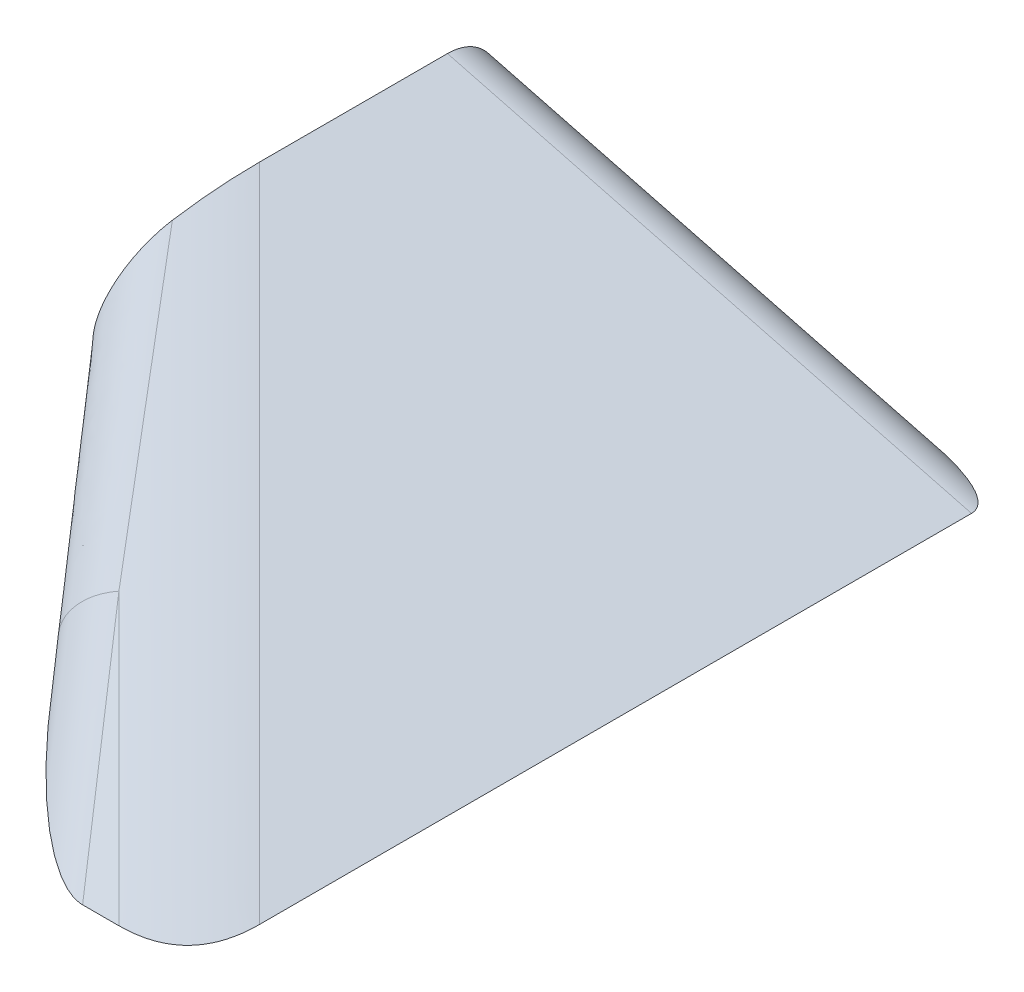
ISO-10303-21;
HEADER;
FILE_DESCRIPTION(('STEP AP214'),'2;1');
FILE_NAME('part.step','',(''),(''),'','','');
FILE_SCHEMA(('AUTOMOTIVE_DESIGN { 1 0 10303 214 1 1 1 1 }'));
ENDSEC;
DATA;
#1=APPLICATION_CONTEXT('core data for automotive mechanical design processes');
#2=APPLICATION_PROTOCOL_DEFINITION('international standard','automotive_design',2000,#1);
#3=PRODUCT_CONTEXT('',#1,'mechanical');
#4=PRODUCT('Part','Part','',(#3));
#5=PRODUCT_RELATED_PRODUCT_CATEGORY('part','',(#4));
#6=PRODUCT_DEFINITION_FORMATION('','',#4);
#7=PRODUCT_DEFINITION_CONTEXT('part definition',#1,'design');
#8=PRODUCT_DEFINITION('design','',#6,#7);
#9=PRODUCT_DEFINITION_SHAPE('','',#8);
#10=(LENGTH_UNIT() NAMED_UNIT(*) SI_UNIT(.MILLI.,.METRE.));
#11=(NAMED_UNIT(*) PLANE_ANGLE_UNIT() SI_UNIT($,.RADIAN.));
#12=(NAMED_UNIT(*) SI_UNIT($,.STERADIAN.) SOLID_ANGLE_UNIT());
#13=UNCERTAINTY_MEASURE_WITH_UNIT(LENGTH_MEASURE(1.E-05),#10,'distance_accuracy_value','');
#14=(GEOMETRIC_REPRESENTATION_CONTEXT(3) GLOBAL_UNCERTAINTY_ASSIGNED_CONTEXT((#13)) GLOBAL_UNIT_ASSIGNED_CONTEXT((#10,
#11,#12)) REPRESENTATION_CONTEXT('',''));
#15=CARTESIAN_POINT('',(0.,0.,0.));
#16=DIRECTION('',(0.,0.,1.));
#17=DIRECTION('',(1.,0.,0.));
#18=AXIS2_PLACEMENT_3D('',#15,#16,#17);
#19=CARTESIAN_POINT('',(48.7418307411752,-4.83911253394136,5.6054391966769));
#20=DIRECTION('',(0.967822506788272,-0.251633851764951,0.));
#21=DIRECTION('',(0.251633851764951,0.967822506788272,0.));
#22=AXIS2_PLACEMENT_3D('',#19,#20,#21);
#23=CYLINDRICAL_SURFACE('',#22,5.);
#24=DIRECTION('',(-0.967822506788272,0.251633851764951,0.));
#25=VECTOR('',#24,1.);
#26=CARTESIAN_POINT('',(50.,0.,5.6054391966769));
#27=LINE('',#26,#25);
#28=CARTESIAN_POINT('',(50.,0.,5.6054391966769));
#29=VERTEX_POINT('',#28);
#30=CARTESIAN_POINT('',(0.,13.,5.6054391966769));
#31=VERTEX_POINT('',#30);
#32=EDGE_CURVE('E309',#29,#31,#27,.T.);
#33=ORIENTED_EDGE('',*,*,#32,.F.);
#34=CARTESIAN_POINT('',(30.1298594567854,0.,5.6054391966769));
#35=DIRECTION('',(0.,1.,0.));
#36=DIRECTION('',(1.,0.,0.));
#37=AXIS2_PLACEMENT_3D('',#34,#35,#36);
#38=ELLIPSE('',#37,19.8701405432146,5.);
#39=CARTESIAN_POINT('',(30.1298594567854,0.,0.605439196676902));
#40=VERTEX_POINT('',#39);
#41=EDGE_CURVE('E60',#40,#29,#38,.F.);
#42=ORIENTED_EDGE('',*,*,#41,.F.);
#43=DIRECTION('',(0.967822506788272,-0.251633851764951,0.));
#44=VECTOR('',#43,1.);
#45=CARTESIAN_POINT('',(-1.25816925882475,8.16088746605863,0.605439196676902));
#46=LINE('',#45,#44);
#47=CARTESIAN_POINT('',(0.,7.8337634587642,0.605439196676902));
#48=VERTEX_POINT('',#47);
#49=EDGE_CURVE('E314',#48,#40,#46,.T.);
#50=ORIENTED_EDGE('',*,*,#49,.F.);
#51=CARTESIAN_POINT('',(0.,7.8337634587642,5.6054391966769));
#52=DIRECTION('',(-1.,0.,0.));
#53=DIRECTION('',(0.,-1.,0.));
#54=AXIS2_PLACEMENT_3D('',#51,#52,#53);
#55=ELLIPSE('',#54,5.1662365412358,5.);
#56=EDGE_CURVE('E13',#31,#48,#55,.T.);
#57=ORIENTED_EDGE('',*,*,#56,.F.);
#58=EDGE_LOOP('',(#33,#42,#50,#57));
#59=FACE_BOUND('',#58,.T.);
#60=ADVANCED_FACE('F52',(#59),#23,.T.);
#61=CARTESIAN_POINT('',(41.3406741769916,-0.433818451414277,82.026045247877));
#62=CARTESIAN_POINT('',(38.0495624952533,-1.10877184402587,84.6220198346199));
#63=CARTESIAN_POINT('',(37.516118186423,-5.27293098533425,83.9885547178839));
#64=CARTESIAN_POINT('',(38.0262377467079,0.589513796405166,78.0901519870549));
#65=CARTESIAN_POINT('',(34.7351260649738,-0.0854395962544923,80.6861265736629));
#66=CARTESIAN_POINT('',(34.2016817562063,-4.24959873750271,80.0526614570015));
#67=CARTESIAN_POINT('',(34.7118013164572,1.61284604423197,74.1542587261977));
#68=CARTESIAN_POINT('',(31.4206896347651,0.937892651537313,76.7502333127901));
#69=CARTESIAN_POINT('',(30.8872453259896,-3.22626648967117,76.1167681961192));
#70=CARTESIAN_POINT('',(28.0829284560217,3.65951053990032,66.2824722044128));
#71=CARTESIAN_POINT('',(24.7918167744049,2.98455714718795,68.8784467911123));
#72=CARTESIAN_POINT('',(24.2583724655563,-1.17960199400808,68.2449816743546));
#73=CARTESIAN_POINT('',(24.768492025837,4.68284278774186,62.3465789434852));
#74=CARTESIAN_POINT('',(21.4773803441991,4.00788939506355,64.9425535302429));
#75=CARTESIAN_POINT('',(20.9439360353396,-0.15626974617654,64.3090884134723));
#76=CARTESIAN_POINT('',(21.4540555956852,5.70617503559076,58.4106856825224));
#77=CARTESIAN_POINT('',(18.1629439139284,5.0312216430015,61.0066602692964));
#78=CARTESIAN_POINT('',(17.6294996051229,0.867062501655003,60.3731951525899));
#79=CARTESIAN_POINT('',(18.2165856825218,6.7483027452774,54.4024562060529));
#80=CARTESIAN_POINT('',(14.8243559395047,6.15661385019669,57.0420870496683));
#81=CARTESIAN_POINT('',(14.3149467323636,1.89040167475108,56.4371636161882));
#82=CARTESIAN_POINT('',(14.9768739226901,7.77272766724253,50.3915841282957));
#83=CARTESIAN_POINT('',(11.5137585086086,7.25953494720531,53.1107526004791));
#84=CARTESIAN_POINT('',(10.9985740374899,2.89951339498482,52.4989710410258));
#85=CARTESIAN_POINT('',(8.4927419400755,9.78701604969136,42.365431087597));
#86=CARTESIAN_POINT('',(4.89039916140003,9.44185821496917,45.245513375669));
#87=CARTESIAN_POINT('',(4.36246152866897,4.88991297072696,44.6185874368009));
#88=CARTESIAN_POINT('',(5.2483218509461,10.7768804719873,38.3501502505632));
#89=CARTESIAN_POINT('',(1.57620845957919,10.5212593551998,41.3099119172568));
#90=CARTESIAN_POINT('',(1.04272181107538,5.87120160040377,40.6763965221585));
#91=CARTESIAN_POINT('',(-1.24562671704329,12.7229483799044,30.315839017919));
#92=CARTESIAN_POINT('',(-5.05408451096477,12.657368652311,33.4364390147358));
#93=CARTESIAN_POINT('',(-5.60003160623196,7.80664143248347,32.788126839106));
#94=CARTESIAN_POINT('',(-4.49515518779594,13.6791519188913,26.2968086282636));
#95=CARTESIAN_POINT('',(-8.37130132419818,13.7139586402492,29.4972440490211));
#96=CARTESIAN_POINT('',(-8.92304530074655,8.76079267790943,28.8420480768699));
#97=CARTESIAN_POINT('',(-10.9996664302257,15.5587053600291,18.2555346234179));
#98=CARTESIAN_POINT('',(-15.0084330809639,15.8053917631293,21.6156500878618));
#99=CARTESIAN_POINT('',(-15.5723005760408,10.6424204751441,20.946057437458));
#100=CARTESIAN_POINT('',(-14.2546493512924,16.4820543464173,14.2332909218523));
#101=CARTESIAN_POINT('',(-18.3291691481162,16.8400089830542,17.6722760081184));
#102=CARTESIAN_POINT('',(-18.898542244144,11.569896283284,16.9961454565854));
#103=CARTESIAN_POINT('',(-17.5124393936455,17.3893522826176,10.2098238725611));
#104=CARTESIAN_POINT('',(-21.6142758418197,17.8527138942713,13.7712118093456));
#105=CARTESIAN_POINT('',(-22.2262796666207,12.4842383731219,13.0444572673943));
#106=(BOUNDED_SURFACE() B_SPLINE_SURFACE(3,2,((#61,#62,#63),(#64,#65,#66),(#67,#68,#69),(#70,
#71,#72),(#73,#74,#75),(#76,#77,#78),(#79,#80,#81),(#82,#83,#84),(#85,#86,#87),(#88,#89,#90),
(#91,#92,#93),(#94,#95,#96),(#97,#98,#99),(#100,#101,#102),(#103,#104,#105)),.UNSPECIFIED.,.F.,
.F.,.F.) B_SPLINE_SURFACE_WITH_KNOTS((4,2,3,2,2,2,4),(3,3),(0.,15.7389828611675,
31.4779657223351,47.2174584478331,62.9565127964518,78.6955421912963,94.4350099407343),(0.,1.),
.UNSPECIFIED.) GEOMETRIC_REPRESENTATION_ITEM() RATIONAL_B_SPLINE_SURFACE(((1.,0.762261883732866,
1.),(1.,0.762261883738737,1.),(1.,0.762261883741486,1.),(1.,0.762261883740737,1.),(1.,
0.76226188373724,1.),(1.,0.76226188373062,1.),(1.,0.755344512750827,1.),(1.,0.748332514713566,
1.),(1.,0.734156901394405,1.),(1.,0.726993290340792,1.),(1.,0.712551709810776,1.),(1.,
0.705273740515703,1.),(1.,0.690638618898363,1.),(1.,0.683281464376381,1.),(1.,0.675902514662022,1.))) REPRESENTATION_ITEM('') SURFACE());
#107=CARTESIAN_POINT('',(21.4540555957099,0.867062501654466,57.1525164236781));
#108=DIRECTION('',(0.631763143677078,-0.195056870610298,0.750218733116531));
#109=DIRECTION('',(-4.94326801714351E-12,0.967822506787258,0.251633851768851));
#110=AXIS2_PLACEMENT_3D('',#107,#108,#109);
#111=CIRCLE('',#110,5.);
#112=CARTESIAN_POINT('',(21.4540555954323,5.70617503566725,58.4106856822282));
#113=VERTEX_POINT('',#112);
#114=CARTESIAN_POINT('',(17.6294996049193,0.867062501717851,60.3731951523482));
#115=VERTEX_POINT('',#114);
#116=EDGE_CURVE('E285',#113,#115,#111,.T.);
#117=ORIENTED_EDGE('',*,*,#116,.F.);
#118=CARTESIAN_POINT('',(-17.5124393936455,17.3893522826176,10.2098238725611));
#119=CARTESIAN_POINT('',(-14.2546493512923,16.4820543464173,14.2332909218523));
#120=CARTESIAN_POINT('',(-10.9996664302257,15.5587053600291,18.2555346234179));
#121=CARTESIAN_POINT('',(-4.49515518779594,13.6791519188913,26.2968086282636));
#122=CARTESIAN_POINT('',(-1.24562671704329,12.7229483799044,30.315839017919));
#123=CARTESIAN_POINT('',(5.2483218509461,10.7768804719873,38.3501502505632));
#124=CARTESIAN_POINT('',(8.4927419400755,9.78701604969136,42.365431087597));
#125=CARTESIAN_POINT('',(14.9768739226901,7.77272766724253,50.3915841282957));
#126=CARTESIAN_POINT('',(18.2165856825218,6.7483027452774,54.4024562060529));
#127=CARTESIAN_POINT('',(21.4540555956852,5.70617503559076,58.4106856825224));
#128=CARTESIAN_POINT('',(24.768492025837,4.68284278774186,62.3465789434852));
#129=CARTESIAN_POINT('',(28.0829284560217,3.65951053990032,66.2824722044128));
#130=CARTESIAN_POINT('',(34.7118013164572,1.61284604423197,74.1542587261977));
#131=CARTESIAN_POINT('',(38.0262377467079,0.589513796405166,78.0901519870549));
#132=CARTESIAN_POINT('',(41.3406741769916,-0.433818451414277,82.026045247877));
#133=B_SPLINE_CURVE_WITH_KNOTS('',3,(#118,#119,#120,#121,#122,#123,#124,#125,#126,#127,#128,
#129,#130,#131,#132),.UNSPECIFIED.,.F.,.F.,(4,2,2,2,3,2,4),(0.,15.7394677494379,
31.4784971442825,47.2175514929012,62.9570442183992,78.6960270795668,94.4350099407343),.UNSPECIFIED.);
#134=CARTESIAN_POINT('',(5.49916348515578E-05,12.3482385597783,31.8573611210766));
#135=VERTEX_POINT('',#134);
#136=EDGE_CURVE('E246',#135,#113,#133,.T.);
#137=ORIENTED_EDGE('',*,*,#136,.F.);
#138=CARTESIAN_POINT('',(0.,6.17280008419474,39.4381643715065));
#139=CARTESIAN_POINT('',(0.,6.29504613406961,39.4382081725381));
#140=CARTESIAN_POINT('',(0.,6.4171919714762,39.4314466335159));
#141=CARTESIAN_POINT('',(0.,6.65988042108192,39.4053546096408));
#142=CARTESIAN_POINT('',(0.,6.78042594113765,39.3860514785771));
#143=CARTESIAN_POINT('',(0.,7.01746263128237,39.3362433736507));
#144=CARTESIAN_POINT('',(0.,7.13398642079203,39.3058910742249));
#145=CARTESIAN_POINT('',(0.,7.36396420087159,39.2350590085089));
#146=CARTESIAN_POINT('',(0.,7.47741618880498,39.1945728036743));
#147=CARTESIAN_POINT('',(0.,7.72620865071416,39.0942840198724));
#148=CARTESIAN_POINT('',(0.,7.86062233534203,39.0321813979423));
#149=CARTESIAN_POINT('',(0.,8.12333325355131,38.8962872491332));
#150=CARTESIAN_POINT('',(0.,8.25162974986489,38.8224943179014));
#151=CARTESIAN_POINT('',(0.,8.6283335167195,38.5852647444705));
#152=CARTESIAN_POINT('',(0.,8.867228846274,38.4065421476366));
#153=CARTESIAN_POINT('',(0.,9.26275242200559,38.0678923488506));
#154=CARTESIAN_POINT('',(0.,9.42505512057217,37.9143628246973));
#155=CARTESIAN_POINT('',(0.,9.73581302629857,37.593725452108));
#156=CARTESIAN_POINT('',(0.,9.88426158848316,37.4266111590643));
#157=CARTESIAN_POINT('',(0.,10.1678502189255,37.0812823522891));
#158=CARTESIAN_POINT('',(0.,10.3029784959119,36.9030582277794));
#159=CARTESIAN_POINT('',(0.,10.5603262186954,36.5375870874987));
#160=CARTESIAN_POINT('',(0.,10.6825464843503,36.3503406458855));
#161=CARTESIAN_POINT('',(0.,10.9663021684365,35.8831555287042));
#162=CARTESIAN_POINT('',(0.,11.121082605444,35.5990989469655));
#163=CARTESIAN_POINT('',(0.,11.4057918585695,35.0187030410808));
#164=CARTESIAN_POINT('',(0.,11.5357069185279,34.7223570277659));
#165=CARTESIAN_POINT('',(0.,11.7710475850071,34.1205279183225));
#166=CARTESIAN_POINT('',(0.,11.876501443263,33.8150558276026));
#167=CARTESIAN_POINT('',(0.,12.0631749836324,33.1969771707894));
#168=CARTESIAN_POINT('',(0.,12.1444102503762,32.8843753327226));
#169=CARTESIAN_POINT('',(0.,12.2391951590377,32.4510974138532));
#170=CARTESIAN_POINT('',(0.,12.2633021879701,32.3326576786198));
#171=CARTESIAN_POINT('',(0.,12.3079941811153,32.0953183406846));
#172=CARTESIAN_POINT('',(0.,12.3285848999279,31.9764198213979));
#173=CARTESIAN_POINT('',(0.,12.3474196358696,31.8572311004979));
#174=B_SPLINE_CURVE_WITH_KNOTS('',3,(#138,#139,#140,#141,#142,#143,#144,#145,#146,#147,#148,
#149,#150,#151,#152,#153,#154,#155,#156,#157,#158,#159,#160,#161,#162,#163,#164,#165,#166,#167,
#168,#169,#170,#171,#172,#173),.UNSPECIFIED.,.F.,.F.,(4,2,2,2,2,2,2,2,2,2,2,2,2,2,2,2,2,4),(0.,
0.3664023259484,0.732008182114068,1.09274288627071,1.45370736642319,1.89720912411609,
2.34076419998165,3.2321457785317,3.90161459382643,4.57140287929529,5.24177884285247,
5.91211220155324,6.88120229618062,7.85082697620878,8.81932613865902,9.7872007213126,
10.149765226158,10.5117305701518),.UNSPECIFIED.);
#175=CARTESIAN_POINT('',(0.,6.17280008419475,39.4381643715065));
#176=VERTEX_POINT('',#175);
#177=EDGE_CURVE('E251',#176,#135,#174,.T.);
#178=ORIENTED_EDGE('',*,*,#177,.F.);
#179=CARTESIAN_POINT('',(37.516118186423,-5.27293098533425,83.9885547178839));
#180=CARTESIAN_POINT('',(34.2016817562063,-4.24959873750271,80.0526614570015));
#181=CARTESIAN_POINT('',(30.8872453259896,-3.22626648967117,76.1167681961192));
#182=CARTESIAN_POINT('',(24.2583724655563,-1.17960199400808,68.2449816743546));
#183=CARTESIAN_POINT('',(20.9439360353396,-0.15626974617654,64.3090884134723));
#184=CARTESIAN_POINT('',(17.6294996051229,0.867062501655003,60.3731951525899));
#185=CARTESIAN_POINT('',(14.3149467323636,1.89040167475107,56.4371636161882));
#186=CARTESIAN_POINT('',(10.9985740374899,2.89951339498482,52.4989710410258));
#187=CARTESIAN_POINT('',(4.36246152866897,4.88991297072696,44.6185874368009));
#188=CARTESIAN_POINT('',(1.04272181107538,5.87120160040377,40.6763965221585));
#189=CARTESIAN_POINT('',(-5.60003160623196,7.80664143248346,32.788126839106));
#190=CARTESIAN_POINT('',(-8.92304530074655,8.76079267790943,28.8420480768699));
#191=CARTESIAN_POINT('',(-15.5723005760408,10.6424204751441,20.946057437458));
#192=CARTESIAN_POINT('',(-18.898542244144,11.569896283284,16.9961454565854));
#193=CARTESIAN_POINT('',(-22.2262796666207,12.4842383731219,13.0444572673943));
#194=B_SPLINE_CURVE_WITH_KNOTS('',3,(#179,#180,#181,#182,#183,#184,#185,#186,#187,#188,#189,
#190,#191,#192,#193),.UNSPECIFIED.,.F.,.F.,(4,2,3,2,2,2,4),(0.,15.7389828611675,
31.4779657223351,47.2174584478331,62.9565127964518,78.6955421912963,94.4350099407343),.UNSPECIFIED.);
#195=EDGE_CURVE('E118',#115,#176,#194,.T.);
#196=ORIENTED_EDGE('',*,*,#195,.F.);
#197=EDGE_LOOP('',(#117,#137,#178,#196));
#198=FACE_BOUND('',#197,.T.);
#199=ADVANCED_FACE('F222',(#198),#106,.T.);
#200=CARTESIAN_POINT('',(23.9963133388016,0.0821404234749032,60.1714474935995));
#201=DIRECTION('',(0.631763143677078,-0.195056870610298,0.750218733116531));
#202=DIRECTION('',(0.764911198117051,0.,-0.644135745782779));
#203=AXIS2_PLACEMENT_3D('',#200,#201,#202);
#204=CYLINDRICAL_SURFACE('',#203,5.);
#205=DIRECTION('',(0.631763143677078,-0.195056870610298,0.750218733116531));
#206=VECTOR('',#205,1.);
#207=CARTESIAN_POINT('',(23.9963133388016,4.92125295741626,61.4296167524243));
#208=LINE('',#207,#206);
#209=CARTESIAN_POINT('',(39.9355941725384,0.,80.3575127424868));
#210=VERTEX_POINT('',#209);
#211=EDGE_CURVE('E278',#113,#210,#208,.T.);
#212=ORIENTED_EDGE('',*,*,#211,.F.);
#213=ORIENTED_EDGE('',*,*,#116,.T.);
#214=DIRECTION('',(-0.631763143677078,0.195056870610298,-0.750218733116531));
#215=VECTOR('',#214,1.);
#216=CARTESIAN_POINT('',(20.1717573482163,0.0821404234749032,63.3921262225134));
#217=LINE('',#216,#215);
#218=CARTESIAN_POINT('',(20.4377992056249,0.,63.7080509281861));
#219=VERTEX_POINT('',#218);
#220=EDGE_CURVE('E243',#219,#115,#217,.T.);
#221=ORIENTED_EDGE('',*,*,#220,.F.);
#222=CARTESIAN_POINT('',(24.2623551962102,0.,60.4873721992722));
#223=DIRECTION('',(0.,1.,0.));
#224=DIRECTION('',(0.644135745782779,0.,0.764911198117052));
#225=AXIS2_PLACEMENT_3D('',#222,#223,#224);
#226=ELLIPSE('',#225,25.6335497660548,5.);
#227=EDGE_CURVE('E131',#210,#219,#226,.F.);
#228=ORIENTED_EDGE('',*,*,#227,.F.);
#229=EDGE_LOOP('',(#212,#213,#221,#228));
#230=FACE_BOUND('',#229,.T.);
#231=ADVANCED_FACE('F190',(#230),#204,.T.);
#232=CARTESIAN_POINT('',(-25.4655477147532,19.6210424058358,-1.9120088737132));
#233=CARTESIAN_POINT('',(-12.6529430194786,16.2897651850644,10.9005958215815));
#234=CARTESIAN_POINT('',(0.159661676374758,12.9584879641426,23.7132005171204));
#235=CARTESIAN_POINT('',(25.3148442473489,6.41814049568928,48.8683830886725));
#236=CARTESIAN_POINT('',(37.6574221238037,3.20907024781103,61.2109609648437));
#237=CARTESIAN_POINT('',(52.1243830090643,-0.552339582356705,75.6779218501042));
#238=CARTESIAN_POINT('',(54.2487660181486,-1.10467916471863,77.8023048591984));
#239=CARTESIAN_POINT('',(59.1011055852552,-2.36628745216634,82.6546444262825));
#240=CARTESIAN_POINT('',(61.8290621432708,-3.0755561572504,85.3826009844874));
#241=CARTESIAN_POINT('',(64.5570187014037,-3.78482486236495,88.1105575424436));
#242=CARTESIAN_POINT('',(-31.8386967419608,21.2780611529098,-1.48118399947398));
#243=CARTESIAN_POINT('',(-19.0260920460519,17.9467839324498,11.331420695487));
#244=CARTESIAN_POINT('',(-6.21348735106799,14.6155067112089,24.1440253913003));
#245=CARTESIAN_POINT('',(18.9416952203678,8.07515924277054,49.2992079629688));
#246=CARTESIAN_POINT('',(31.2842730965961,4.86608899488953,61.6417858390829));
#247=CARTESIAN_POINT('',(45.7512339818567,1.10467916471645,76.1087467243435));
#248=CARTESIAN_POINT('',(47.8756169909409,0.552339582358613,78.2331297334376));
#249=CARTESIAN_POINT('',(52.7279565580475,-0.709268705096732,83.0854693005217));
#250=CARTESIAN_POINT('',(55.4559131161482,-1.4185374099559,85.8134258586981));
#251=CARTESIAN_POINT('',(58.1838696741961,-2.12780611529106,88.5413824166829));
#252=CARTESIAN_POINT('',(-38.4378140862285,21.2780611529098,-1.48118399947397));
#253=CARTESIAN_POINT('',(-25.6252093909266,17.9467839321346,11.3314206958152));
#254=CARTESIAN_POINT('',(-12.8126046951134,14.6155067112924,24.144025391362));
#255=CARTESIAN_POINT('',(12.3425778758861,8.07515924269014,49.2992079629093));
#256=CARTESIAN_POINT('',(24.6851557523285,4.86608899488496,61.6417858390831));
#257=CARTESIAN_POINT('',(39.152116637589,1.10467916471728,76.1087467243434));
#258=CARTESIAN_POINT('',(41.2764996466733,0.552339582352791,78.2331297334376));
#259=CARTESIAN_POINT('',(46.1288392137799,-0.70926870508909,83.0854693005218));
#260=CARTESIAN_POINT('',(48.8567957718293,-1.41853741021137,85.8134258586844));
#261=CARTESIAN_POINT('',(51.5847523299284,-2.12780611529098,88.5413824166829));
#262=(BOUNDED_SURFACE() B_SPLINE_SURFACE(2,3,((#232,#233,#234,#235,#236,#237,#238,#239,#240,
#241),(#242,#243,#244,#245,#246,#247,#248,#249,#250,#251),(#252,#253,#254,#255,#256,#257,#258,
#259,#260,#261)),.UNSPECIFIED.,.F.,.F.,.F.) B_SPLINE_SURFACE_WITH_KNOTS((3,3),(4,2,2,2,4),(0.,
1.),(-1.,-0.0606445210772672,0.844250964862911,1.,1.2),
.UNSPECIFIED.) GEOMETRIC_REPRESENTATION_ITEM() RATIONAL_B_SPLINE_SURFACE(((1.,1.,1.,1.,1.,1.,1.,
1.,1.,1.),(0.991402490615546,0.991402490615546,0.991402490615546,0.991402490615546,
0.991402490615546,0.991402490615546,0.991402490615546,0.991402490615546,0.991402490615546,
0.991402490615546),(1.,1.,1.,1.,1.,1.,1.,1.,1.,1.))) REPRESENTATION_ITEM('') SURFACE());
#263=CARTESIAN_POINT('',(0.,13.,23.5535388409137));
#264=CARTESIAN_POINT('',(1.11337466733718E-05,12.9999962693555,23.8654283917482));
#265=CARTESIAN_POINT('',(7.92690814734481E-05,12.9972284740308,24.1773176261041));
#266=CARTESIAN_POINT('',(0.000255780875637373,12.9859081634038,24.8169402601645));
#267=CARTESIAN_POINT('',(0.000366036382757842,12.9770671700662,25.1446685790504));
#268=CARTESIAN_POINT('',(0.000539471931114806,12.9527613492882,25.8157531594058));
#269=CARTESIAN_POINT('',(0.000600116988197761,12.9369968135005,26.1590985771429));
#270=CARTESIAN_POINT('',(0.000641585706861828,12.8979530881798,26.8611903884704));
#271=CARTESIAN_POINT('',(0.000618613271288553,12.8743618672676,27.2199194677417));
#272=CARTESIAN_POINT('',(0.000500661847742343,12.818731132497,27.9525387832412));
#273=CARTESIAN_POINT('',(0.000402570624190518,12.7863666211482,28.3264043152356));
#274=CARTESIAN_POINT('',(0.000195305858036289,12.7122119729518,29.089053592576));
#275=CARTESIAN_POINT('',(8.58399298416299E-05,12.6700831425504,29.4778046294547));
#276=CARTESIAN_POINT('',(1.22841939952817E-05,12.6059856234961,30.0139860957091));
#277=CARTESIAN_POINT('',(1.50537515013192E-07,12.5876770292288,30.1618615133359));
#278=CARTESIAN_POINT('',(-1.89183344826772E-07,12.5449574103071,30.4953958985469));
#279=CARTESIAN_POINT('',(1.85470805335783E-05,12.5201863968394,30.6810089489244));
#280=CARTESIAN_POINT('',(8.09859040782895E-05,12.4485292166682,31.1971826647958));
#281=CARTESIAN_POINT('',(0.000132750347500499,12.3995126859565,31.5274490368884));
#282=CARTESIAN_POINT('',(0.00010998326970464,12.3474085960114,31.8572299807476));
#283=B_SPLINE_CURVE_WITH_KNOTS('',3,(#263,#264,#265,#266,#267,#268,#269,#270,#271,#272,#273,
#274,#275,#276,#277,#278,#279,#280,#281,#282),.UNSPECIFIED.,.F.,.F.,(4,2,2,2,2,2,2,2,2,4),(0.,
0.935656308245345,1.91914270427305,2.95020006153201,4.02863761831281,5.15434802401177,
6.32732287350834,6.77433271760316,7.33609842878568,8.33769182638149),.UNSPECIFIED.);
#284=CARTESIAN_POINT('',(0.,13.,23.5535388409137));
#285=VERTEX_POINT('',#284);
#286=EDGE_CURVE('E333',#135,#285,#283,.F.);
#287=CARTESIAN_POINT('',(-38.4378140862285,21.2780611529098,-1.48118399947397));
#288=CARTESIAN_POINT('',(-25.6252093909266,17.9467839321346,11.3314206958152));
#289=CARTESIAN_POINT('',(-12.8126046951134,14.6155067112924,24.144025391362));
#290=CARTESIAN_POINT('',(12.3425778758861,8.07515924269014,49.2992079629093));
#291=CARTESIAN_POINT('',(24.6851557523285,4.86608899488496,61.6417858390831));
#292=CARTESIAN_POINT('',(39.152116637589,1.10467916471728,76.1087467243434));
#293=CARTESIAN_POINT('',(41.2764996466733,0.552339582352791,78.2331297334376));
#294=CARTESIAN_POINT('',(46.1288392137799,-0.70926870508909,83.0854693005218));
#295=CARTESIAN_POINT('',(48.8567957718293,-1.41853741021137,85.8134258586844));
#296=CARTESIAN_POINT('',(51.5847523299284,-2.12780611529098,88.5413824166829));
#297=(BOUNDED_CURVE() B_SPLINE_CURVE(3,(#287,#288,#289,#290,#291,#292,#293,#294,#295,#296),
.UNSPECIFIED.,.F.,.F.) B_SPLINE_CURVE_WITH_KNOTS((4,2,2,2,4),(-1.,-0.0606445210772672,
0.844250964862911,1.,1.2),
.UNSPECIFIED.) CURVE() GEOMETRIC_REPRESENTATION_ITEM() RATIONAL_B_SPLINE_CURVE((1.,1.,1.,1.,1.,
1.,1.,1.,1.,1.)) REPRESENTATION_ITEM(''));
#298=CARTESIAN_POINT('',(43.4008826557323,0.,80.3575127424868));
#299=VERTEX_POINT('',#298);
#300=EDGE_CURVE('E121',#299,#113,#297,.F.);
#301=CARTESIAN_POINT('',(43.4008826557323,0.,80.3575127424868));
#302=CARTESIAN_POINT('',(43.5371201530844,-6.99219812057753E-09,80.3575048936548));
#303=CARTESIAN_POINT('',(43.673374803008,2.3978948823836E-06,80.3552901967959));
#304=CARTESIAN_POINT('',(43.9416456664497,1.051847545245E-05,80.346128635607));
#305=CARTESIAN_POINT('',(44.0736668722658,1.61330930987295E-05,80.3393251483311));
#306=CARTESIAN_POINT('',(44.333461977759,2.91300719770746E-05,80.3209915036849));
#307=CARTESIAN_POINT('',(44.4612459585824,3.64552078789334E-05,80.3096071698382));
#308=CARTESIAN_POINT('',(44.7125441310522,5.15544875858046E-05,80.2821065885267));
#309=CARTESIAN_POINT('',(44.8360743096678,5.93093470310943E-05,80.2661377739737));
#310=CARTESIAN_POINT('',(45.0788452827881,7.41883806419586E-05,80.2294673479534));
#311=CARTESIAN_POINT('',(45.1981081787,8.13242172562106E-05,80.208913198328));
#312=CARTESIAN_POINT('',(45.4323238087025,9.4122780560613E-05,80.1630721358852));
#313=CARTESIAN_POINT('',(45.5473048835995,9.98206194130781E-05,80.1379309079086));
#314=CARTESIAN_POINT('',(45.7729362930764,0.000109140138560322,80.0829179074585));
#315=CARTESIAN_POINT('',(45.8836210114567,0.000112812463513841,80.0531878797306));
#316=CARTESIAN_POINT('',(46.1006390870801,0.000117718092639412,79.9890019581286));
#317=CARTESIAN_POINT('',(46.2070123082913,0.000119009574763151,79.9546814104192));
#318=CARTESIAN_POINT('',(46.4153882243767,0.00011903096655317,79.8813212872289));
#319=CARTESIAN_POINT('',(46.5174352036527,0.00011781894552416,79.842407993177));
#320=CARTESIAN_POINT('',(46.7171377563331,0.000112952259483234,79.7598739357273));
#321=CARTESIAN_POINT('',(46.8148405129955,0.000109348788300212,79.7163675742481));
#322=CARTESIAN_POINT('',(47.0058458014804,0.00010005384025438,79.6246551558354));
#323=CARTESIAN_POINT('',(47.0991960556593,9.4401562194742E-05,79.5765490542767));
#324=CARTESIAN_POINT('',(47.2364014043261,8.47758891417987E-05,79.500607292533));
#325=CARTESIAN_POINT('',(47.2814046855522,8.13997470869496E-05,79.4748287377623));
#326=CARTESIAN_POINT('',(47.3703116775611,7.43795754781706E-05,79.4221151714568));
#327=CARTESIAN_POINT('',(47.4142208331868,7.07375553576126E-05,79.3951893680961));
#328=CARTESIAN_POINT('',(47.500936225757,6.3294702200986E-05,79.3401832269444));
#329=CARTESIAN_POINT('',(47.5437475415069,5.9494968032531E-05,79.3121108942422));
#330=CARTESIAN_POINT('',(47.6282663419246,5.18615340709599E-05,79.2548127592816));
#331=CARTESIAN_POINT('',(47.6699784162885,4.8028114469794E-05,79.2255937303803));
#332=CARTESIAN_POINT('',(47.7522973130513,4.04662721064582E-05,79.166003542796));
#333=CARTESIAN_POINT('',(47.7929081302585,3.6737467437009E-05,79.1356379039095));
#334=CARTESIAN_POINT('',(47.8730233663304,2.95383058590519E-05,79.073755791987));
#335=CARTESIAN_POINT('',(47.9125310758608,2.60671137900309E-05,79.0422435801537));
#336=CARTESIAN_POINT('',(47.9904390142942,1.95508889349047E-05,78.9780696411993));
#337=CARTESIAN_POINT('',(48.0288417246277,1.65048305442998E-05,78.9454109270336));
#338=CARTESIAN_POINT('',(48.1045387036011,1.10210005410737E-05,78.8789452795241));
#339=CARTESIAN_POINT('',(48.1418345447443,8.58232561558136E-06,78.8451401372834));
#340=CARTESIAN_POINT('',(48.215316903479,4.50902810318857E-06,78.7763829279924));
#341=CARTESIAN_POINT('',(48.2515039930077,2.87398419429039E-06,78.7414314721985));
#342=CARTESIAN_POINT('',(48.3227681200936,6.19929840557318E-07,78.6703827940707));
#343=CARTESIAN_POINT('',(48.3578446475664,1.37982074649456E-09,78.6342850600669));
#344=CARTESIAN_POINT('',(48.4255821346376,-1.32961268211404E-09,78.562331115238));
#345=CARTESIAN_POINT('',(48.4582845475032,5.70412473252449E-07,78.5265139134118));
#346=CARTESIAN_POINT('',(48.5226793880779,2.64378458241877E-06,78.4538025839798));
#347=CARTESIAN_POINT('',(48.5543687080422,4.14803197367815E-06,78.4169057046245));
#348=CARTESIAN_POINT('',(48.6167369212816,7.8948292107631E-06,78.3420353480395));
#349=CARTESIAN_POINT('',(48.6474116346628,1.01400945557113E-05,78.3040583876848));
#350=CARTESIAN_POINT('',(48.7077491587377,1.51897467123865E-05,78.2270302670644));
#351=CARTESIAN_POINT('',(48.7374066971247,1.79966448478226E-05,78.18797498676));
#352=CARTESIAN_POINT('',(48.8251208312888,2.70281279050281E-05,78.0688423116657));
#353=CARTESIAN_POINT('',(48.8813875931426,3.38255567160041E-05,77.987436515403));
#354=CARTESIAN_POINT('',(48.9898897251739,4.77956562845041E-05,77.8203538206179));
#355=CARTESIAN_POINT('',(49.0420569121515,5.49722715875794E-05,77.7346328297021));
#356=CARTESIAN_POINT('',(49.1423690329639,6.87510768819972E-05,77.5589187579278));
#357=CARTESIAN_POINT('',(49.1904297256192,7.53413165366174E-05,77.4688776424711));
#358=CARTESIAN_POINT('',(49.2825294230405,8.72086657871452E-05,77.2845279470782));
#359=CARTESIAN_POINT('',(49.3264696197567,9.24571022798106E-05,77.1901701314639));
#360=CARTESIAN_POINT('',(49.4103290949389,0.000101115269554563,76.9971868601503));
#361=CARTESIAN_POINT('',(49.4501370497765,0.000104481454406286,76.8985131612966));
#362=CARTESIAN_POINT('',(49.5257301251591,0.000109060306771609,76.6968964999414));
#363=CARTESIAN_POINT('',(49.5613936367167,0.000110218520838434,76.5939080912242));
#364=CARTESIAN_POINT('',(49.6286937622067,0.00011027677124765,76.3836586029198));
#365=CARTESIAN_POINT('',(49.6602007897789,0.000109117005367853,76.2763561990552));
#366=CARTESIAN_POINT('',(49.7191815332076,0.000104644261041908,76.0574742173642));
#367=CARTESIAN_POINT('',(49.7465199168296,0.000101272733035477,75.9458583316484));
#368=CARTESIAN_POINT('',(49.7971547914178,9.26910670615677E-05,75.7183441688914));
#369=CARTESIAN_POINT('',(49.8203122685583,8.74307935857684E-05,75.602415111597));
#370=CARTESIAN_POINT('',(49.8625747092993,7.55961501284027E-05,75.366269002019));
#371=CARTESIAN_POINT('',(49.8815388096082,6.89873773710887E-05,75.2460268928614));
#372=CARTESIAN_POINT('',(49.9154023131178,5.51909159806152E-05,75.0012491967183));
#373=CARTESIAN_POINT('',(49.930160582735,4.79917344794933E-05,74.8766942346287));
#374=CARTESIAN_POINT('',(49.9555980683437,3.39603433200592E-05,74.6232848477799));
#375=CARTESIAN_POINT('',(49.9661371672229,2.71463441788494E-05,74.4944164843831));
#376=CARTESIAN_POINT('',(49.9831234750956,1.50454183569482E-05,74.2323772764601));
#377=CARTESIAN_POINT('',(49.9894327232399,9.81278362146861E-06,74.0991976674686));
#378=CARTESIAN_POINT('',(49.9979348744314,2.23912803548015E-06,73.8285230854349));
#379=CARTESIAN_POINT('',(49.9999924598104,-6.04846027758632E-09,73.6910237797209));
#380=CARTESIAN_POINT('',(49.9999999999897,2.68985823946336E-12,73.5535388410296));
#381=B_SPLINE_CURVE_WITH_KNOTS('',3,(#301,#302,#303,#304,#305,#306,#307,#308,#309,#310,#311,
#312,#313,#314,#315,#316,#317,#318,#319,#320,#321,#322,#323,#324,#325,#326,#327,#328,#329,#330,
#331,#332,#333,#334,#335,#336,#337,#338,#339,#340,#341,#342,#343,#344,#345,#346,#347,#348,#349,
#350,#351,#352,#353,#354,#355,#356,#357,#358,#359,#360,#361,#362,#363,#364,#365,#366,#367,#368,
#369,#370,#371,#372,#373,#374,#375,#376,#377,#378,#379,#380),.UNSPECIFIED.,.F.,.F.,(4,2,2,2,2,2,
2,2,2,2,2,2,2,2,2,2,2,2,2,2,2,2,2,2,2,2,2,2,2,2,2,2,2,2,2,2,2,2,2,4),(0.,0.408719781281589,
0.805226798987434,1.19000083089466,1.56357124409342,1.92652095816735,2.27949018792147,
2.6231797390221,2.95835357639507,3.28584033865003,3.60653344317889,3.92138942944314,
4.07696092797149,4.23145884884849,4.38501844736725,4.53777781108495,4.68987754815714,
4.84146044425021,4.99267109154037,5.1436554941429,5.29456065504882,5.4455341502374,
5.59101395729494,5.73690395944122,5.88333463198503,6.03043531669996,6.32712453901273,
6.6280052193962,6.93404165371275,7.24615500399327,7.56521836210148,7.89205358568182,
8.22742975176057,8.57206299940208,8.92661749764007,9.29170727152914,9.66789863827324,
10.0557130378013,10.4556300802648,10.868090671253),.UNSPECIFIED.);
#382=CARTESIAN_POINT('',(50.,0.,73.5535388410297));
#383=VERTEX_POINT('',#382);
#384=EDGE_CURVE('E338',#383,#299,#381,.F.);
#385=CARTESIAN_POINT('',(64.5570187014037,-3.78482486236495,88.1105575424436));
#386=CARTESIAN_POINT('',(61.8290621432708,-3.0755561572504,85.3826009844874));
#387=CARTESIAN_POINT('',(59.1011055852552,-2.36628745216634,82.6546444262825));
#388=CARTESIAN_POINT('',(54.2487660181486,-1.10467916471863,77.8023048591984));
#389=CARTESIAN_POINT('',(52.1243830090643,-0.552339582356705,75.6779218501042));
#390=CARTESIAN_POINT('',(37.6574221238037,3.20907024781103,61.2109609648437));
#391=CARTESIAN_POINT('',(25.3148442473489,6.41814049568928,48.8683830886725));
#392=CARTESIAN_POINT('',(0.159661676374758,12.9584879641426,23.7132005171204));
#393=CARTESIAN_POINT('',(-12.6529430194786,16.2897651850644,10.9005958215815));
#394=CARTESIAN_POINT('',(-25.4655477147532,19.6210424058358,-1.9120088737132));
#395=(BOUNDED_CURVE() B_SPLINE_CURVE(3,(#385,#386,#387,#388,#389,#390,#391,#392,#393,#394),
.UNSPECIFIED.,.F.,.F.) B_SPLINE_CURVE_WITH_KNOTS((4,2,2,2,4),(-1.,-0.8,-0.644250964862911,
0.260644521077267,1.2),
.UNSPECIFIED.) CURVE() GEOMETRIC_REPRESENTATION_ITEM() RATIONAL_B_SPLINE_CURVE((1.,1.,1.,1.,1.,
1.,1.,1.,1.,1.)) REPRESENTATION_ITEM(''));
#396=EDGE_CURVE('E318',#285,#383,#395,.F.);
#397=ORIENTED_EDGE('',*,*,#286,.F.);
#398=ORIENTED_EDGE('',*,*,#136,.T.);
#399=ORIENTED_EDGE('',*,*,#300,.F.);
#400=ORIENTED_EDGE('',*,*,#384,.F.);
#401=ORIENTED_EDGE('',*,*,#396,.F.);
#402=EDGE_LOOP('',(#397,#398,#399,#400,#401));
#403=FACE_BOUND('',#402,.T.);
#404=ADVANCED_FACE('F182',(#403),#262,.T.);
#405=CARTESIAN_POINT('',(50.,0.,0.));
#406=DIRECTION('',(-0.251633851764951,-0.967822506788272,0.));
#407=DIRECTION('',(0.,0.,1.));
#408=AXIS2_PLACEMENT_3D('',#405,#406,#407);
#409=PLANE('',#408);
#410=DIRECTION('',(0.,0.,1.));
#411=VECTOR('',#410,1.);
#412=CARTESIAN_POINT('',(50.,0.,0.));
#413=LINE('',#412,#411);
#414=EDGE_CURVE('E150',#29,#383,#413,.T.);
#415=ORIENTED_EDGE('',*,*,#414,.F.);
#416=ORIENTED_EDGE('',*,*,#32,.T.);
#417=DIRECTION('',(0.,0.,-1.));
#418=VECTOR('',#417,1.);
#419=CARTESIAN_POINT('',(0.,13.,0.));
#420=LINE('',#419,#418);
#421=EDGE_CURVE('E162',#285,#31,#420,.T.);
#422=ORIENTED_EDGE('',*,*,#421,.F.);
#423=ORIENTED_EDGE('',*,*,#396,.T.);
#424=EDGE_LOOP('',(#415,#416,#422,#423));
#425=FACE_BOUND('',#424,.T.);
#426=ADVANCED_FACE('F179',(#425),#409,.F.);
#427=CARTESIAN_POINT('',(0.,0.,80.3575127424868));
#428=DIRECTION('',(0.,-0.967822506788272,-0.251633851764951));
#429=DIRECTION('',(-1.,0.,0.));
#430=AXIS2_PLACEMENT_3D('',#427,#428,#429);
#431=PLANE('',#430);
#432=ORIENTED_EDGE('',*,*,#300,.T.);
#433=ORIENTED_EDGE('',*,*,#211,.T.);
#434=DIRECTION('',(-1.,0.,0.));
#435=VECTOR('',#434,1.);
#436=CARTESIAN_POINT('',(0.,0.,80.3575127424868));
#437=LINE('',#436,#435);
#438=EDGE_CURVE('E134',#299,#210,#437,.T.);
#439=ORIENTED_EDGE('',*,*,#438,.F.);
#440=EDGE_LOOP('',(#432,#433,#439));
#441=FACE_BOUND('',#440,.T.);
#442=ADVANCED_FACE('F165',(#441),#431,.F.);
#443=CARTESIAN_POINT('',(0.,13.,0.));
#444=DIRECTION('',(-1.,0.,0.));
#445=DIRECTION('',(0.,0.,1.));
#446=AXIS2_PLACEMENT_3D('',#443,#444,#445);
#447=PLANE('',#446);
#448=ORIENTED_EDGE('',*,*,#421,.T.);
#449=ORIENTED_EDGE('',*,*,#56,.T.);
#450=DIRECTION('',(0.,-1.,0.));
#451=VECTOR('',#450,1.);
#452=CARTESIAN_POINT('',(0.,13.,0.605439196676902));
#453=LINE('',#452,#451);
#454=CARTESIAN_POINT('',(0.,0.,0.605439196676902));
#455=VERTEX_POINT('',#454);
#456=EDGE_CURVE('E122',#48,#455,#453,.T.);
#457=ORIENTED_EDGE('',*,*,#456,.T.);
#458=DIRECTION('',(0.,0.,-1.));
#459=VECTOR('',#458,1.);
#460=CARTESIAN_POINT('',(0.,0.,0.));
#461=LINE('',#460,#459);
#462=CARTESIAN_POINT('',(0.,0.,39.4381643715065));
#463=VERTEX_POINT('',#462);
#464=EDGE_CURVE('E128',#463,#455,#461,.T.);
#465=ORIENTED_EDGE('',*,*,#464,.F.);
#466=DIRECTION('',(0.,-1.,0.));
#467=VECTOR('',#466,1.);
#468=CARTESIAN_POINT('',(0.,13.,39.4381643715065));
#469=LINE('',#468,#467);
#470=EDGE_CURVE('E112',#176,#463,#469,.T.);
#471=ORIENTED_EDGE('',*,*,#470,.F.);
#472=ORIENTED_EDGE('',*,*,#177,.T.);
#473=ORIENTED_EDGE('',*,*,#286,.T.);
#474=EDGE_LOOP('',(#448,#449,#457,#465,#471,#472,#473));
#475=FACE_BOUND('',#474,.T.);
#476=ADVANCED_FACE('F136',(#475),#447,.T.);
#477=CARTESIAN_POINT('',(-19.4314456546807,13.,16.3633226565732));
#478=DIRECTION('',(0.764911198117051,0.,-0.644135745782779));
#479=DIRECTION('',(-0.644135745782779,0.,-0.764911198117052));
#480=AXIS2_PLACEMENT_3D('',#477,#478,#479);
#481=PLANE('',#480);
#482=ORIENTED_EDGE('',*,*,#220,.T.);
#483=ORIENTED_EDGE('',*,*,#195,.T.);
#484=ORIENTED_EDGE('',*,*,#470,.T.);
#485=DIRECTION('',(0.644135745782779,0.,0.764911198117051));
#486=VECTOR('',#485,1.);
#487=CARTESIAN_POINT('',(-19.4314456546807,0.,16.3633226565732));
#488=LINE('',#487,#486);
#489=EDGE_CURVE('E116',#463,#219,#488,.T.);
#490=ORIENTED_EDGE('',*,*,#489,.T.);
#491=EDGE_LOOP('',(#482,#483,#484,#490));
#492=FACE_BOUND('',#491,.T.);
#493=ADVANCED_FACE('F115',(#492),#481,.F.);
#494=CARTESIAN_POINT('',(0.,13.,0.605439196676902));
#495=DIRECTION('',(0.,0.,-1.));
#496=DIRECTION('',(-1.,0.,0.));
#497=AXIS2_PLACEMENT_3D('',#494,#495,#496);
#498=PLANE('',#497);
#499=ORIENTED_EDGE('',*,*,#456,.F.);
#500=ORIENTED_EDGE('',*,*,#49,.T.);
#501=DIRECTION('',(1.,0.,0.));
#502=VECTOR('',#501,1.);
#503=CARTESIAN_POINT('',(0.,0.,0.605439196676902));
#504=LINE('',#503,#502);
#505=EDGE_CURVE('E321',#455,#40,#504,.T.);
#506=ORIENTED_EDGE('',*,*,#505,.F.);
#507=EDGE_LOOP('',(#499,#500,#506));
#508=FACE_BOUND('',#507,.T.);
#509=ADVANCED_FACE('F263',(#508),#498,.T.);
#510=CARTESIAN_POINT('',(0.,0.,0.));
#511=DIRECTION('',(0.,1.,0.));
#512=DIRECTION('',(0.,0.,1.));
#513=AXIS2_PLACEMENT_3D('',#510,#511,#512);
#514=PLANE('',#513);
#515=ORIENTED_EDGE('',*,*,#505,.T.);
#516=ORIENTED_EDGE('',*,*,#41,.T.);
#517=ORIENTED_EDGE('',*,*,#414,.T.);
#518=ORIENTED_EDGE('',*,*,#384,.T.);
#519=ORIENTED_EDGE('',*,*,#438,.T.);
#520=ORIENTED_EDGE('',*,*,#227,.T.);
#521=ORIENTED_EDGE('',*,*,#489,.F.);
#522=ORIENTED_EDGE('',*,*,#464,.T.);
#523=EDGE_LOOP('',(#515,#516,#517,#518,#519,#520,#521,#522));
#524=FACE_BOUND('',#523,.T.);
#525=ADVANCED_FACE('F127',(#524),#514,.F.);
#526=CLOSED_SHELL('',(#60,#199,#231,#404,#426,#442,#476,#493,#509,#525));
#527=MANIFOLD_SOLID_BREP('B2',#526);
#528=ADVANCED_BREP_SHAPE_REPRESENTATION('',(#18,#527),#14);
#529=SHAPE_DEFINITION_REPRESENTATION(#9,#528);
ENDSEC;
END-ISO-10303-21;
